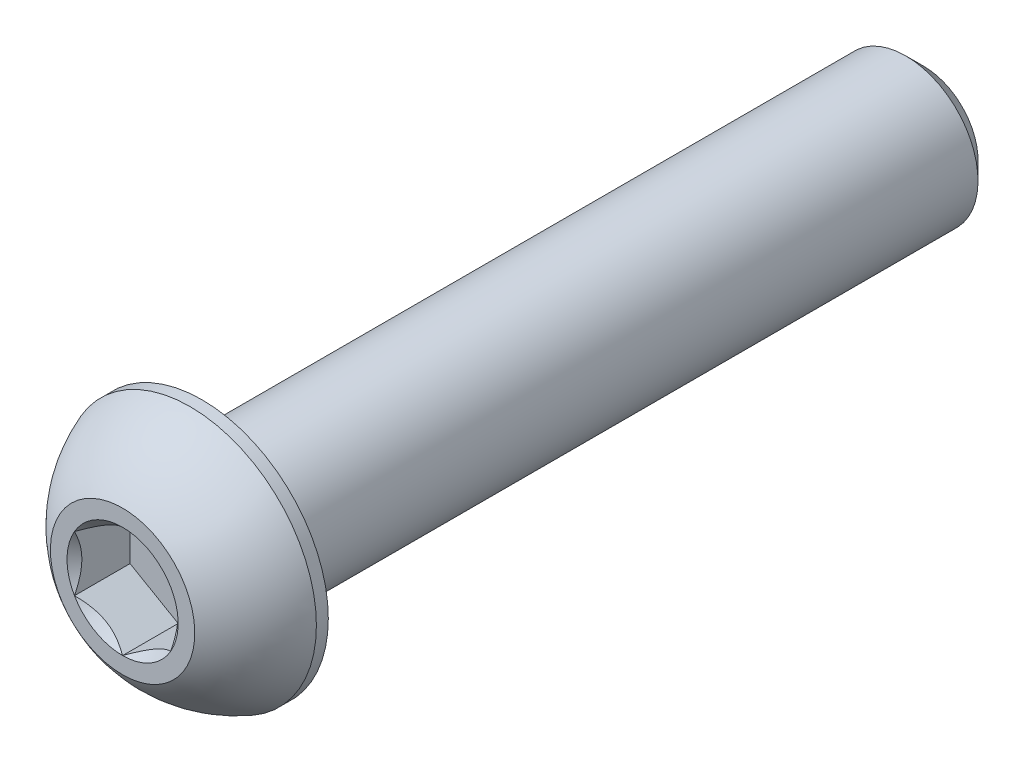
ISO-10303-21;
HEADER;
FILE_DESCRIPTION(('STEP AP214'),'2;1');
FILE_NAME('part.step','',(''),(''),'','','');
FILE_SCHEMA(('AUTOMOTIVE_DESIGN { 1 0 10303 214 1 1 1 1 }'));
ENDSEC;
DATA;
#1=APPLICATION_CONTEXT('core data for automotive mechanical design processes');
#2=APPLICATION_PROTOCOL_DEFINITION('international standard','automotive_design',2000,#1);
#3=PRODUCT_CONTEXT('',#1,'mechanical');
#4=PRODUCT('Part','Part','',(#3));
#5=PRODUCT_RELATED_PRODUCT_CATEGORY('part','',(#4));
#6=PRODUCT_DEFINITION_FORMATION('','',#4);
#7=PRODUCT_DEFINITION_CONTEXT('part definition',#1,'design');
#8=PRODUCT_DEFINITION('design','',#6,#7);
#9=PRODUCT_DEFINITION_SHAPE('','',#8);
#10=(LENGTH_UNIT() NAMED_UNIT(*) SI_UNIT(.MILLI.,.METRE.));
#11=(NAMED_UNIT(*) PLANE_ANGLE_UNIT() SI_UNIT($,.RADIAN.));
#12=(NAMED_UNIT(*) SI_UNIT($,.STERADIAN.) SOLID_ANGLE_UNIT());
#13=UNCERTAINTY_MEASURE_WITH_UNIT(LENGTH_MEASURE(1.E-05),#10,'distance_accuracy_value','');
#14=(GEOMETRIC_REPRESENTATION_CONTEXT(3) GLOBAL_UNCERTAINTY_ASSIGNED_CONTEXT((#13)) GLOBAL_UNIT_ASSIGNED_CONTEXT((#10,
#11,#12)) REPRESENTATION_CONTEXT('',''));
#15=CARTESIAN_POINT('',(0.,0.,0.));
#16=DIRECTION('',(0.,0.,1.));
#17=DIRECTION('',(1.,0.,0.));
#18=AXIS2_PLACEMENT_3D('',#15,#16,#17);
#19=CARTESIAN_POINT('',(0.,-3.00000000000002,-33.3));
#20=DIRECTION('',(0.,0.,-1.));
#21=DIRECTION('',(0.,1.,0.));
#22=AXIS2_PLACEMENT_3D('',#19,#20,#21);
#23=PLANE('',#22);
#24=CARTESIAN_POINT('',(0.,0.,-33.3));
#25=DIRECTION('',(0.,0.,-1.));
#26=DIRECTION('',(0.,1.,0.));
#27=AXIS2_PLACEMENT_3D('',#24,#25,#26);
#28=CIRCLE('',#27,2.25000000000002);
#29=CARTESIAN_POINT('',(0.,2.25000000000001,-33.3));
#30=VERTEX_POINT('',#29);
#31=EDGE_CURVE('E178',#30,#30,#28,.T.);
#32=ORIENTED_EDGE('',*,*,#31,.T.);
#33=EDGE_LOOP('',(#32));
#34=FACE_BOUND('',#33,.T.);
#35=ADVANCED_FACE('F38',(#34),#23,.T.);
#36=CARTESIAN_POINT('',(0.,0.,-33.3));
#37=DIRECTION('',(0.,0.,-1.));
#38=DIRECTION('',(0.,1.,0.));
#39=AXIS2_PLACEMENT_3D('',#36,#37,#38);
#40=CYLINDRICAL_SURFACE('',#39,3.00000000000001);
#41=CARTESIAN_POINT('',(0.,0.,-32.55));
#42=DIRECTION('',(0.,0.,-1.));
#43=DIRECTION('',(0.,1.,0.));
#44=AXIS2_PLACEMENT_3D('',#41,#42,#43);
#45=CIRCLE('',#44,3.00000000000001);
#46=CARTESIAN_POINT('',(0.,3.,-32.55));
#47=VERTEX_POINT('',#46);
#48=EDGE_CURVE('E52',#47,#47,#45,.F.);
#49=ORIENTED_EDGE('',*,*,#48,.T.);
#50=EDGE_LOOP('',(#49));
#51=FACE_BOUND('',#50,.T.);
#52=CARTESIAN_POINT('',(0.,0.,-3.3));
#53=DIRECTION('',(0.,0.,1.));
#54=DIRECTION('',(1.,0.,0.));
#55=AXIS2_PLACEMENT_3D('',#52,#53,#54);
#56=CIRCLE('',#55,3.00000000000001);
#57=CARTESIAN_POINT('',(3.00000000000001,0.,-3.3));
#58=VERTEX_POINT('',#57);
#59=EDGE_CURVE('E175',#58,#58,#56,.F.);
#60=ORIENTED_EDGE('',*,*,#59,.T.);
#61=EDGE_LOOP('',(#60));
#62=FACE_BOUND('',#61,.T.);
#63=ADVANCED_FACE('F183',(#51,#62),#40,.T.);
#64=CARTESIAN_POINT('',(0.,0.,-33.3));
#65=DIRECTION('',(0.,0.,1.));
#66=DIRECTION('',(0.,-1.,0.));
#67=AXIS2_PLACEMENT_3D('',#64,#65,#66);
#68=CONICAL_SURFACE('',#67,2.25000000000002,0.785398163397448);
#69=ORIENTED_EDGE('',*,*,#48,.F.);
#70=EDGE_LOOP('',(#69));
#71=FACE_BOUND('',#70,.T.);
#72=ORIENTED_EDGE('',*,*,#31,.F.);
#73=EDGE_LOOP('',(#72));
#74=FACE_BOUND('',#73,.T.);
#75=ADVANCED_FACE('F40',(#71,#74),#68,.T.);
#76=CARTESIAN_POINT('',(0.,0.,-4.71132352941177));
#77=DIRECTION('',(0.,0.,1.));
#78=DIRECTION('',(0.,-1.,0.));
#79=AXIS2_PLACEMENT_3D('',#76,#77,#78);
#80=SPHERICAL_SURFACE('',#79,5.58538892099638);
#81=CARTESIAN_POINT('',(0.,0.,0.));
#82=DIRECTION('',(0.,0.,1.));
#83=DIRECTION('',(1.,0.,0.));
#84=AXIS2_PLACEMENT_3D('',#81,#82,#83);
#85=CIRCLE('',#84,3.);
#86=CARTESIAN_POINT('',(0.,-3.,0.));
#87=VERTEX_POINT('',#86);
#88=EDGE_CURVE('E172',#87,#87,#85,.T.);
#89=CARTESIAN_POINT('',(0.,0.,-2.805));
#90=DIRECTION('',(0.,0.,1.));
#91=DIRECTION('',(1.,0.,0.));
#92=AXIS2_PLACEMENT_3D('',#89,#90,#91);
#93=CIRCLE('',#92,5.25);
#94=CARTESIAN_POINT('',(0.,-5.25,-2.805));
#95=VERTEX_POINT('',#94);
#96=EDGE_CURVE('E166',#95,#95,#93,.T.);
#97=CARTESIAN_POINT('',(0.,-3.,0.));
#98=CARTESIAN_POINT('',(0.,-3.03216841047471,-0.0204836076687055));
#99=CARTESIAN_POINT('',(0.,-3.06412696701745,-0.041296774706013));
#100=CARTESIAN_POINT('',(0.,-3.12761110680184,-0.0835732798883741));
#101=CARTESIAN_POINT('',(0.,-3.15913669004349,-0.105036618033428));
#102=CARTESIAN_POINT('',(0.,-3.22174161778855,-0.148604517801822));
#103=CARTESIAN_POINT('',(0.,-3.25282096229196,-0.170709079425164));
#104=CARTESIAN_POINT('',(0.,-3.3145203830256,-0.215550136391721));
#105=CARTESIAN_POINT('',(0.,-3.34514045925583,-0.238286631734938));
#106=CARTESIAN_POINT('',(0.,-3.40590849355866,-0.284382020830627));
#107=CARTESIAN_POINT('',(0.,-3.43605645163126,-0.3077409145831));
#108=CARTESIAN_POINT('',(0.,-3.49586760131366,-0.355071298801883));
#109=CARTESIAN_POINT('',(0.,-3.52553079292345,-0.379042789268192));
#110=CARTESIAN_POINT('',(0.,-3.5843599638299,-0.427588309600936));
#111=CARTESIAN_POINT('',(0.,-3.61352594312657,-0.45216233946737));
#112=CARTESIAN_POINT('',(0.,-3.67134845242053,-0.501902628105112));
#113=CARTESIAN_POINT('',(0.,-3.70000498241782,-0.527068886876421));
#114=CARTESIAN_POINT('',(0.,-3.75679656980689,-0.577983074450791));
#115=CARTESIAN_POINT('',(0.,-3.78493162719868,-0.603731003253853));
#116=CARTESIAN_POINT('',(0.,-3.84066846488056,-0.655797727942868));
#117=CARTESIAN_POINT('',(0.,-3.86827024517066,-0.682116523828821));
#118=CARTESIAN_POINT('',(0.,-3.92292894789283,-0.735313940225863));
#119=CARTESIAN_POINT('',(0.,-3.94998587032491,-0.762192560736951));
#120=CARTESIAN_POINT('',(0.,-4.00354350517958,-0.81649834904145));
#121=CARTESIAN_POINT('',(0.,-4.03004421760217,-0.843925516834861));
#122=CARTESIAN_POINT('',(0.,-4.08247831365261,-0.899316892210192));
#123=CARTESIAN_POINT('',(0.,-4.10841169728045,-0.927281099792112));
#124=CARTESIAN_POINT('',(0.,-4.1597002549878,-0.983734821927125));
#125=CARTESIAN_POINT('',(0.,-4.18505542906731,-1.01222433648022));
#126=CARTESIAN_POINT('',(0.,-4.23517692952119,-1.06971671933959));
#127=CARTESIAN_POINT('',(0.,-4.25994325589556,-1.09871958764587));
#128=CARTESIAN_POINT('',(0.,-4.30887666984256,-1.15722650940808));
#129=CARTESIAN_POINT('',(0.,-4.33304375741518,-1.18673056286401));
#130=CARTESIAN_POINT('',(0.,-4.38076855408201,-1.24622747604199));
#131=CARTESIAN_POINT('',(0.,-4.40432626317621,-1.27622033576403));
#132=CARTESIAN_POINT('',(0.,-4.45082241888372,-1.33668227750444));
#133=CARTESIAN_POINT('',(0.,-4.47376086549703,-1.3671513595228));
#134=CARTESIAN_POINT('',(0.,-4.51900887206146,-1.4285529620796));
#135=CARTESIAN_POINT('',(0.,-4.54131843201258,-1.45948548261803));
#136=CARTESIAN_POINT('',(0.,-4.58529930493053,-1.52180098399588));
#137=CARTESIAN_POINT('',(0.,-4.60697061789735,-1.5531839648353));
#138=CARTESIAN_POINT('',(0.,-4.64966590431095,-1.61638721959847));
#139=CARTESIAN_POINT('',(0.,-4.67068987775773,-1.64820749352221));
#140=CARTESIAN_POINT('',(0.,-4.71208166419702,-1.71227198376418));
#141=CARTESIAN_POINT('',(0.,-4.73244947718953,-1.74451620008241));
#142=CARTESIAN_POINT('',(0.,-4.77252039708775,-1.80941504655213));
#143=CARTESIAN_POINT('',(0.,-4.79222350399347,-1.84206967670363));
#144=CARTESIAN_POINT('',(0.,-4.83095674497554,-1.90777565008234));
#145=CARTESIAN_POINT('',(0.,-4.84998687905189,-1.94082699330955));
#146=CARTESIAN_POINT('',(0.,-4.8873661899807,-2.00731252563814));
#147=CARTESIAN_POINT('',(0.,-4.90571536683316,-2.04074671473952));
#148=CARTESIAN_POINT('',(0.,-4.94172506465618,-2.10798391097428));
#149=CARTESIAN_POINT('',(0.,-4.95938558562673,-2.14178691810765));
#150=CARTESIAN_POINT('',(0.,-4.99401056185103,-2.20974756786458));
#151=CARTESIAN_POINT('',(0.,-5.01097501710478,-2.24390521048815));
#152=CARTESIAN_POINT('',(0.,-5.04420074452798,-2.31256079972767));
#153=CARTESIAN_POINT('',(0.,-5.06046201669743,-2.34705874634363));
#154=CARTESIAN_POINT('',(0.,-5.09227455404011,-2.41638046989934));
#155=CARTESIAN_POINT('',(0.,-5.10782581921333,-2.45120424683909));
#156=CARTESIAN_POINT('',(0.,-5.13821182242717,-2.52116301839372));
#157=CARTESIAN_POINT('',(0.,-5.15304656046779,-2.5562980130086));
#158=CARTESIAN_POINT('',(0.,-5.18199326796146,-2.62686448517116));
#159=CARTESIAN_POINT('',(0.,-5.19610523741451,-2.66229596271883));
#160=CARTESIAN_POINT('',(0.,-5.22360055144049,-2.7334405099534));
#161=CARTESIAN_POINT('',(0.,-5.23698389601341,-2.76915357964029));
#162=CARTESIAN_POINT('',(0.,-5.25,-2.805));
#163=B_SPLINE_CURVE_WITH_KNOTS('',3,(#97,#98,#99,#100,#101,#102,#103,#104,#105,#106,#107,#108,
#109,#110,#111,#112,#113,#114,#115,#116,#117,#118,#119,#120,#121,#122,#123,#124,#125,#126,#127,
#128,#129,#130,#131,#132,#133,#134,#135,#136,#137,#138,#139,#140,#141,#142,#143,#144,#145,#146,
#147,#148,#149,#150,#151,#152,#153,#154,#155,#156,#157,#158,#159,#160,#161,#162),.UNSPECIFIED.,
.F.,.F.,(4,2,2,2,2,2,2,2,2,2,2,2,2,2,2,2,2,2,2,2,2,2,2,2,2,2,2,2,2,2,2,2,4),(0.,
0.114407188898184,0.228814377796368,0.343221566694552,0.457628755592736,0.572035944490919,
0.686443133389104,0.800850322287288,0.915257511185472,1.02966470008366,1.14407188898184,
1.25847907788002,1.37288626677821,1.48729345567639,1.60170064457458,1.71610783347276,
1.83051502237094,1.94492221126913,2.05932940016731,2.1737365890655,2.28814377796368,
2.40255096686186,2.51695815576005,2.63136534465823,2.74577253355642,2.8601797224546,
2.97458691135278,3.08899410025097,3.20340128914915,3.31780847804734,3.43221566694552,
3.5466228558437,3.66103004474189),.UNSPECIFIED.);
#164=EDGE_CURVE('BSEAM188',#87,#95,#163,.T.);
#165=ORIENTED_EDGE('',*,*,#88,.F.);
#166=ORIENTED_EDGE('',*,*,#96,.T.);
#167=ORIENTED_EDGE('',*,*,#164,.T.);
#168=ORIENTED_EDGE('',*,*,#164,.F.);
#169=EDGE_LOOP('',(#165,#167,#166,#168));
#170=FACE_BOUND('',#169,.T.);
#171=ADVANCED_FACE('F188',(#170),#80,.T.);
#172=CARTESIAN_POINT('',(0.,-3.,0.));
#173=DIRECTION('',(0.,0.,-1.));
#174=DIRECTION('',(-1.,0.,0.));
#175=AXIS2_PLACEMENT_3D('',#172,#173,#174);
#176=PLANE('',#175);
#177=CARTESIAN_POINT('',(0.,0.,0.));
#178=DIRECTION('',(0.,0.,1.));
#179=DIRECTION('',(1.,0.,0.));
#180=AXIS2_PLACEMENT_3D('',#177,#178,#179);
#181=CIRCLE('',#180,2.3094010767585);
#182=CARTESIAN_POINT('',(-2.,1.15470053837925,0.));
#183=VERTEX_POINT('',#182);
#184=CARTESIAN_POINT('',(-2.,-1.15470053837925,0.));
#185=VERTEX_POINT('',#184);
#186=EDGE_CURVE('E65',#183,#185,#181,.T.);
#187=ORIENTED_EDGE('',*,*,#186,.F.);
#188=CARTESIAN_POINT('',(0.,2.3094010767585,0.));
#189=VERTEX_POINT('',#188);
#190=EDGE_CURVE('E137',#189,#183,#181,.T.);
#191=ORIENTED_EDGE('',*,*,#190,.F.);
#192=CARTESIAN_POINT('',(2.,1.15470053837925,0.));
#193=VERTEX_POINT('',#192);
#194=EDGE_CURVE('E134',#193,#189,#181,.T.);
#195=ORIENTED_EDGE('',*,*,#194,.F.);
#196=CARTESIAN_POINT('',(2.,-1.15470053837925,0.));
#197=VERTEX_POINT('',#196);
#198=EDGE_CURVE('E105',#197,#193,#181,.T.);
#199=ORIENTED_EDGE('',*,*,#198,.F.);
#200=CARTESIAN_POINT('',(0.,-2.3094010767585,0.));
#201=VERTEX_POINT('',#200);
#202=EDGE_CURVE('E97',#201,#197,#181,.T.);
#203=ORIENTED_EDGE('',*,*,#202,.F.);
#204=EDGE_CURVE('E58',#185,#201,#181,.T.);
#205=ORIENTED_EDGE('',*,*,#204,.F.);
#206=EDGE_LOOP('',(#187,#191,#195,#199,#203,#205));
#207=FACE_BOUND('',#206,.T.);
#208=ORIENTED_EDGE('',*,*,#88,.T.);
#209=EDGE_LOOP('',(#208));
#210=FACE_BOUND('',#209,.T.);
#211=ADVANCED_FACE('F131',(#207,#210),#176,.F.);
#212=CARTESIAN_POINT('',(0.,-5.25,-3.3));
#213=DIRECTION('',(0.,0.,1.));
#214=DIRECTION('',(1.,0.,0.));
#215=AXIS2_PLACEMENT_3D('',#212,#213,#214);
#216=PLANE('',#215);
#217=ORIENTED_EDGE('',*,*,#59,.F.);
#218=EDGE_LOOP('',(#217));
#219=FACE_BOUND('',#218,.T.);
#220=CARTESIAN_POINT('',(0.,0.,-3.3));
#221=DIRECTION('',(0.,0.,1.));
#222=DIRECTION('',(1.,0.,0.));
#223=AXIS2_PLACEMENT_3D('',#220,#221,#222);
#224=CIRCLE('',#223,5.25);
#225=CARTESIAN_POINT('',(5.25,0.,-3.3));
#226=VERTEX_POINT('',#225);
#227=EDGE_CURVE('E169',#226,#226,#224,.T.);
#228=ORIENTED_EDGE('',*,*,#227,.F.);
#229=EDGE_LOOP('',(#228));
#230=FACE_BOUND('',#229,.T.);
#231=ADVANCED_FACE('F202',(#219,#230),#216,.F.);
#232=CARTESIAN_POINT('',(0.,0.,0.));
#233=DIRECTION('',(0.,0.,1.));
#234=DIRECTION('',(1.,0.,0.));
#235=AXIS2_PLACEMENT_3D('',#232,#233,#234);
#236=CYLINDRICAL_SURFACE('',#235,5.25);
#237=ORIENTED_EDGE('',*,*,#96,.F.);
#238=EDGE_LOOP('',(#237));
#239=FACE_BOUND('',#238,.T.);
#240=ORIENTED_EDGE('',*,*,#227,.T.);
#241=EDGE_LOOP('',(#240));
#242=FACE_BOUND('',#241,.T.);
#243=ADVANCED_FACE('F205',(#239,#242),#236,.T.);
#244=CARTESIAN_POINT('',(0.,0.,0.));
#245=DIRECTION('',(0.,0.,1.));
#246=DIRECTION('',(1.,0.,0.));
#247=AXIS2_PLACEMENT_3D('',#244,#245,#246);
#248=CONICAL_SURFACE('',#247,2.3094010767585,0.78539816339745);
#249=ORIENTED_EDGE('',*,*,#198,.T.);
#250=CARTESIAN_POINT('',(2.,-2.30294417292923,0.740771355027719));
#251=CARTESIAN_POINT('',(2.,-2.24687002663712,0.698443273625962));
#252=CARTESIAN_POINT('',(2.,-2.19048190536959,0.656525156864336));
#253=CARTESIAN_POINT('',(2.,-2.07695390496424,0.573690417861016));
#254=CARTESIAN_POINT('',(2.,-2.01981384066453,0.532774049668073));
#255=CARTESIAN_POINT('',(2.,-1.90424016804775,0.451833452018562));
#256=CARTESIAN_POINT('',(2.,-1.84579996743909,0.411818591559867));
#257=CARTESIAN_POINT('',(2.,-1.7279274546176,0.333288993664292));
#258=CARTESIAN_POINT('',(2.,-1.66849521292323,0.294774150243141));
#259=CARTESIAN_POINT('',(2.,-1.48162995710019,0.177640651604293));
#260=CARTESIAN_POINT('',(2.,-1.35220318163536,0.102145901729643));
#261=CARTESIAN_POINT('',(2.,-1.08689521592924,-0.0359506490056192));
#262=CARTESIAN_POINT('',(2.,-0.951037763938189,-0.0985959140965047));
#263=CARTESIAN_POINT('',(2.,-0.747111912259406,-0.175236456124857));
#264=CARTESIAN_POINT('',(2.,-0.682064034147873,-0.197232820080877));
#265=CARTESIAN_POINT('',(2.,-0.550398103294749,-0.23600331233986));
#266=CARTESIAN_POINT('',(2.,-0.483779942722473,-0.252777080878817));
#267=CARTESIAN_POINT('',(2.,-0.350484328847652,-0.279951742115555));
#268=CARTESIAN_POINT('',(2.,-0.283829489364783,-0.290461823258314));
#269=CARTESIAN_POINT('',(2.,-0.149806987139375,-0.304903914455084));
#270=CARTESIAN_POINT('',(2.,-0.0824394489341198,-0.308837055266886));
#271=CARTESIAN_POINT('',(2.,0.0499055622944916,-0.309833523066282));
#272=CARTESIAN_POINT('',(2.,0.114881285143174,-0.30714035514959));
#273=CARTESIAN_POINT('',(2.,0.244275921482762,-0.295569929577307));
#274=CARTESIAN_POINT('',(2.,0.308694780266755,-0.286692071166775));
#275=CARTESIAN_POINT('',(2.,0.437599788610706,-0.263086340703851));
#276=CARTESIAN_POINT('',(2.,0.502067428644597,-0.248258916553487));
#277=CARTESIAN_POINT('',(2.,0.629594322598307,-0.213542116372029));
#278=CARTESIAN_POINT('',(2.,0.692653693883152,-0.193653163893723));
#279=CARTESIAN_POINT('',(2.,0.891187889210546,-0.1235530207438));
#280=CARTESIAN_POINT('',(2.,1.02383545707306,-0.0653581996784902));
#281=CARTESIAN_POINT('',(2.,1.28290932150074,0.0640305754595772));
#282=CARTESIAN_POINT('',(2.,1.4093111258757,0.135271231414842));
#283=CARTESIAN_POINT('',(2.,1.59200441438963,0.246441991874721));
#284=CARTESIAN_POINT('',(2.,1.65027549026191,0.283182190337376));
#285=CARTESIAN_POINT('',(2.,1.76581760389243,0.358214514183767));
#286=CARTESIAN_POINT('',(2.,1.82308856543105,0.39650675711804));
#287=CARTESIAN_POINT('',(2.,1.93629654762084,0.474042264081226));
#288=CARTESIAN_POINT('',(2.,1.99224062500539,0.513275276133586));
#289=CARTESIAN_POINT('',(2.,2.103364240299,0.592778830736517));
#290=CARTESIAN_POINT('',(2.,2.15854398422468,0.633049085000598));
#291=CARTESIAN_POINT('',(2.,2.21340370692659,0.673744238145943));
#292=B_SPLINE_CURVE_WITH_KNOTS('',3,(#250,#251,#252,#253,#254,#255,#256,#257,#258,#259,#260,
#261,#262,#263,#264,#265,#266,#267,#268,#269,#270,#271,#272,#273,#274,#275,#276,#277,#278,#279,
#280,#281,#282,#283,#284,#285,#286,#287,#288,#289,#290,#291),.UNSPECIFIED.,.F.,.F.,(4,2,2,2,2,2,
2,2,2,2,2,2,2,2,2,2,2,2,2,2,4),(0.,0.210772731976891,0.421598374658588,0.634057554623487,
0.846501695870169,1.29562155455624,1.74319622821645,1.94902062110207,2.15485918928325,
2.35699582502635,2.5590977043214,2.75388435553556,2.94868993014814,3.14690093452585,
3.34509535789701,3.77838155837653,4.21325029921625,4.41989056685646,4.6265465146092,
4.83152377111289,5.03644465914084),.UNSPECIFIED.);
#293=EDGE_CURVE('E11',#197,#193,#292,.T.);
#294=ORIENTED_EDGE('',*,*,#293,.F.);
#295=EDGE_LOOP('',(#249,#294));
#296=FACE_BOUND('',#295,.T.);
#297=ADVANCED_FACE('F109',(#296),#248,.F.);
#298=ORIENTED_EDGE('',*,*,#194,.T.);
#299=CARTESIAN_POINT('',(2.0002,1.15458506832541,0.000115478713660073));
#300=CARTESIAN_POINT('',(1.93144696596929,1.19427965103065,-0.0395469097744074));
#301=CARTESIAN_POINT('',(1.86154425786449,1.23463799837204,-0.0768800177158378));
#302=CARTESIAN_POINT('',(1.71900475544956,1.31693321846145,-0.145236314863857));
#303=CARTESIAN_POINT('',(1.64635440243464,1.35887791933134,-0.176221466262779));
#304=CARTESIAN_POINT('',(1.49985839894603,1.44345742638069,-0.229299783455857));
#305=CARTESIAN_POINT('',(1.42605006475371,1.48607068799507,-0.251526372823389));
#306=CARTESIAN_POINT('',(1.27680836816474,1.57223542169503,-0.285771183324919));
#307=CARTESIAN_POINT('',(1.20137956608185,1.61578426088223,-0.297814970855865));
#308=CARTESIAN_POINT('',(1.07138449932892,1.69083694766536,-0.308681488094428));
#309=CARTESIAN_POINT('',(1.01698621602989,1.72224381117151,-0.310290246390029));
#310=CARTESIAN_POINT('',(0.908278544480305,1.78500621460364,-0.307581122401288));
#311=CARTESIAN_POINT('',(0.85396919407866,1.81636173267754,-0.303261162242025));
#312=CARTESIAN_POINT('',(0.745863272410661,1.87877671565355,-0.288940432590093));
#313=CARTESIAN_POINT('',(0.692067343445206,1.90983580972306,-0.278933307237993));
#314=CARTESIAN_POINT('',(0.585405737694425,1.97141691651548,-0.25378756975034));
#315=CARTESIAN_POINT('',(0.532539989929286,2.00193897021859,-0.23864935095776));
#316=CARTESIAN_POINT('',(0.397120266910155,2.08012358375727,-0.193705496570809));
#317=CARTESIAN_POINT('',(0.315406165150521,2.12730124240478,-0.160511160574183));
#318=CARTESIAN_POINT('',(0.195252962742198,2.19667172615922,-0.10447417682863));
#319=CARTESIAN_POINT('',(0.155657147890823,2.21953238052245,-0.08478529705306));
#320=CARTESIAN_POINT('',(0.0771990411121287,2.26483018959123,-0.0436126816351289));
#321=CARTESIAN_POINT('',(0.0383363164062608,2.28726759416161,-0.0221300483487535));
#322=CARTESIAN_POINT('',(-0.000199999999998559,2.30951654681234,0.000115478713658964));
#323=B_SPLINE_CURVE_WITH_KNOTS('',3,(#299,#300,#301,#302,#303,#304,#305,#306,#307,#308,#309,
#310,#311,#312,#313,#314,#315,#316,#317,#318,#319,#320,#321,#322),.UNSPECIFIED.,.F.,.F.,(4,2,2,
2,2,2,2,2,2,2,2,4),(0.,0.266420613771064,0.534393751523389,0.798110374376915,1.06116288956937,
1.24939906803722,1.43770123566248,1.62621426093932,1.81471283831913,2.11415604834145,
2.2634717071779,2.41269626969771),.UNSPECIFIED.);
#324=EDGE_CURVE('E136',#193,#189,#323,.T.);
#325=ORIENTED_EDGE('',*,*,#324,.F.);
#326=EDGE_LOOP('',(#298,#325));
#327=FACE_BOUND('',#326,.T.);
#328=ADVANCED_FACE('F290',(#327),#248,.F.);
#329=ORIENTED_EDGE('',*,*,#190,.T.);
#330=CARTESIAN_POINT('',(0.00020000000000133,2.30951654681234,0.000115478713659074));
#331=CARTESIAN_POINT('',(-0.0685530340307042,2.26982196410711,-0.0395469097744084));
#332=CARTESIAN_POINT('',(-0.13845574213551,2.22946361676572,-0.0768800177158387));
#333=CARTESIAN_POINT('',(-0.280995244550435,2.1471683966763,-0.145236314863858));
#334=CARTESIAN_POINT('',(-0.353645597565357,2.10522369580642,-0.17622146626278));
#335=CARTESIAN_POINT('',(-0.500141601053971,2.02064418875706,-0.229299783455859));
#336=CARTESIAN_POINT('',(-0.573949935246294,1.97803092714269,-0.251526372823391));
#337=CARTESIAN_POINT('',(-0.723191631835264,1.89186619344273,-0.285771183324921));
#338=CARTESIAN_POINT('',(-0.798620433918152,1.84831735425552,-0.297814970855867));
#339=CARTESIAN_POINT('',(-0.928615500671079,1.77326466747239,-0.30868148809443));
#340=CARTESIAN_POINT('',(-0.983013783970109,1.74185780396625,-0.310290246390031));
#341=CARTESIAN_POINT('',(-1.09172145551969,1.67909540053412,-0.30758112240129));
#342=CARTESIAN_POINT('',(-1.14603080592134,1.64773988246021,-0.303261162242027));
#343=CARTESIAN_POINT('',(-1.25413672758934,1.5853248994842,-0.288940432590095));
#344=CARTESIAN_POINT('',(-1.30793265655479,1.55426580541469,-0.278933307237995));
#345=CARTESIAN_POINT('',(-1.41459426230557,1.49268469862228,-0.253787569750342));
#346=CARTESIAN_POINT('',(-1.46746001007071,1.46216264491916,-0.238649350957762));
#347=CARTESIAN_POINT('',(-1.60287973308984,1.38397803138048,-0.193705496570812));
#348=CARTESIAN_POINT('',(-1.68459383484948,1.33680037273297,-0.160511160574186));
#349=CARTESIAN_POINT('',(-1.8047470372578,1.26742988897853,-0.104474176828632));
#350=CARTESIAN_POINT('',(-1.84434285210918,1.24456923461531,-0.0847852970530618));
#351=CARTESIAN_POINT('',(-1.92280095888787,1.19927142554652,-0.0436126816351307));
#352=CARTESIAN_POINT('',(-1.96166368359374,1.17683402097614,-0.0221300483487552));
#353=CARTESIAN_POINT('',(-2.0002,1.15458506832541,0.000115478713657302));
#354=B_SPLINE_CURVE_WITH_KNOTS('',3,(#330,#331,#332,#333,#334,#335,#336,#337,#338,#339,#340,
#341,#342,#343,#344,#345,#346,#347,#348,#349,#350,#351,#352,#353),.UNSPECIFIED.,.F.,.F.,(4,2,2,
2,2,2,2,2,2,2,2,4),(0.,0.266420613771064,0.534393751523389,0.798110374376916,1.06116288956937,
1.24939906803722,1.43770123566248,1.62621426093932,1.81471283831913,2.11415604834145,
2.26347170717791,2.41269626969771),.UNSPECIFIED.);
#355=EDGE_CURVE('E141',#189,#183,#354,.T.);
#356=ORIENTED_EDGE('',*,*,#355,.F.);
#357=EDGE_LOOP('',(#329,#356));
#358=FACE_BOUND('',#357,.T.);
#359=ADVANCED_FACE('F144',(#358),#248,.F.);
#360=ORIENTED_EDGE('',*,*,#186,.T.);
#361=CARTESIAN_POINT('',(-2.,-2.30294417292923,0.740771355027721));
#362=CARTESIAN_POINT('',(-2.,-2.24687002663712,0.698443273625963));
#363=CARTESIAN_POINT('',(-2.,-2.19048190536959,0.656525156864337));
#364=CARTESIAN_POINT('',(-2.,-2.07695390496424,0.573690417861017));
#365=CARTESIAN_POINT('',(-2.,-2.01981384066454,0.532774049668073));
#366=CARTESIAN_POINT('',(-2.,-1.90424016804776,0.451833452018563));
#367=CARTESIAN_POINT('',(-2.,-1.8457999674391,0.411818591559867));
#368=CARTESIAN_POINT('',(-2.,-1.7279274546176,0.333288993664293));
#369=CARTESIAN_POINT('',(-2.,-1.66849521292324,0.294774150243142));
#370=CARTESIAN_POINT('',(-2.,-1.4816299571002,0.177640651604294));
#371=CARTESIAN_POINT('',(-2.,-1.35220318163536,0.102145901729644));
#372=CARTESIAN_POINT('',(-2.,-1.08689521592924,-0.0359506490056196));
#373=CARTESIAN_POINT('',(-2.,-0.951037763938191,-0.0985959140965053));
#374=CARTESIAN_POINT('',(-2.,-0.747111912259408,-0.175236456124857));
#375=CARTESIAN_POINT('',(-2.,-0.682064034147875,-0.197232820080877));
#376=CARTESIAN_POINT('',(-2.,-0.550398103294751,-0.236003312339861));
#377=CARTESIAN_POINT('',(-2.,-0.483779942722475,-0.252777080878818));
#378=CARTESIAN_POINT('',(-2.,-0.350484328847654,-0.279951742115556));
#379=CARTESIAN_POINT('',(-2.,-0.283829489364785,-0.290461823258315));
#380=CARTESIAN_POINT('',(-2.,-0.149806987139377,-0.304903914455085));
#381=CARTESIAN_POINT('',(-2.,-0.0824394489341219,-0.308837055266887));
#382=CARTESIAN_POINT('',(-2.,0.0499055622944896,-0.309833523066284));
#383=CARTESIAN_POINT('',(-2.,0.114881285143172,-0.307140355149592));
#384=CARTESIAN_POINT('',(-2.,0.24427592148276,-0.295569929577308));
#385=CARTESIAN_POINT('',(-2.,0.308694780266753,-0.286692071166777));
#386=CARTESIAN_POINT('',(-2.,0.437599788610705,-0.263086340703852));
#387=CARTESIAN_POINT('',(-2.,0.502067428644595,-0.248258916553489));
#388=CARTESIAN_POINT('',(-2.,0.629594322598306,-0.213542116372031));
#389=CARTESIAN_POINT('',(-2.,0.69265369388315,-0.193653163893725));
#390=CARTESIAN_POINT('',(-2.,0.891187889210544,-0.123553020743803));
#391=CARTESIAN_POINT('',(-2.,1.02383545707306,-0.0653581996784927));
#392=CARTESIAN_POINT('',(-2.,1.28290932150074,0.0640305754595745));
#393=CARTESIAN_POINT('',(-2.,1.4093111258757,0.135271231414839));
#394=CARTESIAN_POINT('',(-2.,1.59200441438963,0.246441991874718));
#395=CARTESIAN_POINT('',(-2.,1.65027549026191,0.283182190337372));
#396=CARTESIAN_POINT('',(-2.,1.76581760389242,0.358214514183763));
#397=CARTESIAN_POINT('',(-2.,1.82308856543104,0.396506757118036));
#398=CARTESIAN_POINT('',(-2.,1.93629654762084,0.474042264081222));
#399=CARTESIAN_POINT('',(-2.,1.99224062500538,0.513275276133582));
#400=CARTESIAN_POINT('',(-2.,2.10336424029899,0.592778830736512));
#401=CARTESIAN_POINT('',(-2.,2.15854398422468,0.633049085000594));
#402=CARTESIAN_POINT('',(-2.,2.21340370692658,0.673744238145939));
#403=B_SPLINE_CURVE_WITH_KNOTS('',3,(#361,#362,#363,#364,#365,#366,#367,#368,#369,#370,#371,
#372,#373,#374,#375,#376,#377,#378,#379,#380,#381,#382,#383,#384,#385,#386,#387,#388,#389,#390,
#391,#392,#393,#394,#395,#396,#397,#398,#399,#400,#401,#402),.UNSPECIFIED.,.F.,.F.,(4,2,2,2,2,2,
2,2,2,2,2,2,2,2,2,2,2,2,2,2,4),(0.,0.210772731976891,0.421598374658589,0.634057554623488,
0.84650169587017,1.29562155455624,1.74319622821645,1.94902062110207,2.15485918928326,
2.35699582502635,2.5590977043214,2.75388435553556,2.94868993014815,3.14690093452585,
3.34509535789702,3.77838155837653,4.21325029921625,4.41989056685646,4.6265465146092,
4.83152377111289,5.03644465914084),.UNSPECIFIED.);
#404=EDGE_CURVE('E148',#183,#185,#403,.F.);
#405=ORIENTED_EDGE('',*,*,#404,.F.);
#406=EDGE_LOOP('',(#360,#405));
#407=FACE_BOUND('',#406,.T.);
#408=ADVANCED_FACE('F284',(#407),#248,.F.);
#409=ORIENTED_EDGE('',*,*,#204,.T.);
#410=CARTESIAN_POINT('',(-2.0002,-1.15458506832541,0.000115478713657905));
#411=CARTESIAN_POINT('',(-1.93144696596929,-1.19427965103064,-0.0395469097744099));
#412=CARTESIAN_POINT('',(-1.86154425786449,-1.23463799837204,-0.0768800177158401));
#413=CARTESIAN_POINT('',(-1.71900475544956,-1.31693321846145,-0.145236314863859));
#414=CARTESIAN_POINT('',(-1.64635440243464,-1.35887791933134,-0.176221466262781));
#415=CARTESIAN_POINT('',(-1.49985839894603,-1.44345742638069,-0.229299783455859));
#416=CARTESIAN_POINT('',(-1.4260500647537,-1.48607068799507,-0.251526372823391));
#417=CARTESIAN_POINT('',(-1.27680836816473,-1.57223542169502,-0.285771183324921));
#418=CARTESIAN_POINT('',(-1.20137956608185,-1.61578426088223,-0.297814970855867));
#419=CARTESIAN_POINT('',(-1.07138449932892,-1.69083694766536,-0.30868148809443));
#420=CARTESIAN_POINT('',(-1.01698621602989,-1.72224381117151,-0.310290246390031));
#421=CARTESIAN_POINT('',(-0.908278544480305,-1.78500621460364,-0.30758112240129));
#422=CARTESIAN_POINT('',(-0.853969194078659,-1.81636173267754,-0.303261162242027));
#423=CARTESIAN_POINT('',(-0.745863272410661,-1.87877671565355,-0.288940432590096));
#424=CARTESIAN_POINT('',(-0.692067343445206,-1.90983580972306,-0.278933307237995));
#425=CARTESIAN_POINT('',(-0.585405737694425,-1.97141691651547,-0.253787569750342));
#426=CARTESIAN_POINT('',(-0.532539989929286,-2.00193897021859,-0.238649350957762));
#427=CARTESIAN_POINT('',(-0.397120266910155,-2.08012358375727,-0.193705496570811));
#428=CARTESIAN_POINT('',(-0.31540616515052,-2.12730124240478,-0.160511160574186));
#429=CARTESIAN_POINT('',(-0.195252962742197,-2.19667172615922,-0.104474176828632));
#430=CARTESIAN_POINT('',(-0.155657147890822,-2.21953238052245,-0.0847852970530614));
#431=CARTESIAN_POINT('',(-0.077199041112127,-2.26483018959123,-0.04361268163513));
#432=CARTESIAN_POINT('',(-0.0383363164062589,-2.28726759416161,-0.0221300483487544));
#433=CARTESIAN_POINT('',(0.000200000000000635,-2.30951654681234,0.000115478713658089));
#434=B_SPLINE_CURVE_WITH_KNOTS('',3,(#410,#411,#412,#413,#414,#415,#416,#417,#418,#419,#420,
#421,#422,#423,#424,#425,#426,#427,#428,#429,#430,#431,#432,#433),.UNSPECIFIED.,.F.,.F.,(4,2,2,
2,2,2,2,2,2,2,2,4),(0.,0.266420613771064,0.534393751523388,0.798110374376914,1.06116288956936,
1.24939906803722,1.43770123566247,1.62621426093932,1.81471283831913,2.11415604834145,
2.2634717071779,2.41269626969771),.UNSPECIFIED.);
#435=EDGE_CURVE('E121',#185,#201,#434,.T.);
#436=ORIENTED_EDGE('',*,*,#435,.F.);
#437=EDGE_LOOP('',(#409,#436));
#438=FACE_BOUND('',#437,.T.);
#439=ADVANCED_FACE('F232',(#438),#248,.F.);
#440=ORIENTED_EDGE('',*,*,#202,.T.);
#441=CARTESIAN_POINT('',(-0.000199999999999146,-2.30951654681234,0.000115478713658207));
#442=CARTESIAN_POINT('',(0.0685530340307062,-2.26982196410711,-0.0395469097744093));
#443=CARTESIAN_POINT('',(0.138455742135512,-2.22946361676571,-0.0768800177158394));
#444=CARTESIAN_POINT('',(0.280995244550437,-2.1471683966763,-0.145236314863858));
#445=CARTESIAN_POINT('',(0.353645597565359,-2.10522369580642,-0.17622146626278));
#446=CARTESIAN_POINT('',(0.500141601053972,-2.02064418875706,-0.229299783455858));
#447=CARTESIAN_POINT('',(0.573949935246295,-1.97803092714269,-0.25152637282339));
#448=CARTESIAN_POINT('',(0.723191631835264,-1.89186619344273,-0.28577118332492));
#449=CARTESIAN_POINT('',(0.798620433918152,-1.84831735425552,-0.297814970855866));
#450=CARTESIAN_POINT('',(0.928615500671079,-1.77326466747239,-0.308681488094429));
#451=CARTESIAN_POINT('',(0.983013783970109,-1.74185780396625,-0.310290246390031));
#452=CARTESIAN_POINT('',(1.09172145551969,-1.67909540053412,-0.30758112240129));
#453=CARTESIAN_POINT('',(1.14603080592134,-1.64773988246021,-0.303261162242027));
#454=CARTESIAN_POINT('',(1.25413672758934,-1.5853248994842,-0.288940432590095));
#455=CARTESIAN_POINT('',(1.30793265655479,-1.55426580541469,-0.278933307237995));
#456=CARTESIAN_POINT('',(1.41459426230557,-1.49268469862228,-0.253787569750342));
#457=CARTESIAN_POINT('',(1.46746001007071,-1.46216264491916,-0.238649350957761));
#458=CARTESIAN_POINT('',(1.60287973308984,-1.38397803138048,-0.193705496570811));
#459=CARTESIAN_POINT('',(1.68459383484948,-1.33680037273297,-0.160511160574185));
#460=CARTESIAN_POINT('',(1.8047470372578,-1.26742988897853,-0.104474176828631));
#461=CARTESIAN_POINT('',(1.84434285210918,-1.24456923461531,-0.0847852970530604));
#462=CARTESIAN_POINT('',(1.92280095888787,-1.19927142554652,-0.0436126816351289));
#463=CARTESIAN_POINT('',(1.96166368359374,-1.17683402097614,-0.0221300483487534));
#464=CARTESIAN_POINT('',(2.0002,-1.15458506832541,0.000115478713659019));
#465=B_SPLINE_CURVE_WITH_KNOTS('',3,(#441,#442,#443,#444,#445,#446,#447,#448,#449,#450,#451,
#452,#453,#454,#455,#456,#457,#458,#459,#460,#461,#462,#463,#464),.UNSPECIFIED.,.F.,.F.,(4,2,2,
2,2,2,2,2,2,2,2,4),(0.,0.266420613771063,0.534393751523388,0.798110374376913,1.06116288956936,
1.24939906803722,1.43770123566247,1.62621426093931,1.81471283831913,2.11415604834145,
2.2634717071779,2.41269626969771),.UNSPECIFIED.);
#466=EDGE_CURVE('E101',#201,#197,#465,.T.);
#467=ORIENTED_EDGE('',*,*,#466,.F.);
#468=EDGE_LOOP('',(#440,#467));
#469=FACE_BOUND('',#468,.T.);
#470=ADVANCED_FACE('F99',(#469),#248,.F.);
#471=CARTESIAN_POINT('',(2.,-1.15470053837925,-2.31));
#472=DIRECTION('',(0.,0.,1.));
#473=DIRECTION('',(1.,0.,0.));
#474=AXIS2_PLACEMENT_3D('',#471,#472,#473);
#475=PLANE('',#474);
#476=DIRECTION('',(0.866025403784438,0.5,0.));
#477=VECTOR('',#476,1.);
#478=CARTESIAN_POINT('',(0.,-2.3094010767585,-2.31));
#479=LINE('',#478,#477);
#480=CARTESIAN_POINT('',(0.,-2.3094010767585,-2.31));
#481=VERTEX_POINT('',#480);
#482=CARTESIAN_POINT('',(2.,-1.15470053837925,-2.31));
#483=VERTEX_POINT('',#482);
#484=EDGE_CURVE('E120',#481,#483,#479,.T.);
#485=ORIENTED_EDGE('',*,*,#484,.T.);
#486=DIRECTION('',(0.,1.,0.));
#487=VECTOR('',#486,1.);
#488=CARTESIAN_POINT('',(2.,-1.15470053837925,-2.31));
#489=LINE('',#488,#487);
#490=CARTESIAN_POINT('',(2.,1.15470053837925,-2.31));
#491=VERTEX_POINT('',#490);
#492=EDGE_CURVE('E125',#483,#491,#489,.T.);
#493=ORIENTED_EDGE('',*,*,#492,.T.);
#494=DIRECTION('',(-0.866025403784439,0.5,0.));
#495=VECTOR('',#494,1.);
#496=CARTESIAN_POINT('',(2.,1.15470053837925,-2.31));
#497=LINE('',#496,#495);
#498=CARTESIAN_POINT('',(0.,2.3094010767585,-2.31));
#499=VERTEX_POINT('',#498);
#500=EDGE_CURVE('E274',#491,#499,#497,.T.);
#501=ORIENTED_EDGE('',*,*,#500,.T.);
#502=DIRECTION('',(-0.866025403784438,-0.5,0.));
#503=VECTOR('',#502,1.);
#504=CARTESIAN_POINT('',(0.,2.3094010767585,-2.31));
#505=LINE('',#504,#503);
#506=CARTESIAN_POINT('',(-2.,1.15470053837925,-2.31));
#507=VERTEX_POINT('',#506);
#508=EDGE_CURVE('E157',#499,#507,#505,.T.);
#509=ORIENTED_EDGE('',*,*,#508,.T.);
#510=DIRECTION('',(0.,-1.,0.));
#511=VECTOR('',#510,1.);
#512=CARTESIAN_POINT('',(-2.,1.15470053837925,-2.31));
#513=LINE('',#512,#511);
#514=CARTESIAN_POINT('',(-2.,-1.15470053837925,-2.31));
#515=VERTEX_POINT('',#514);
#516=EDGE_CURVE('E278',#507,#515,#513,.T.);
#517=ORIENTED_EDGE('',*,*,#516,.T.);
#518=DIRECTION('',(0.866025403784439,-0.5,0.));
#519=VECTOR('',#518,1.);
#520=CARTESIAN_POINT('',(-2.,-1.15470053837925,-2.31));
#521=LINE('',#520,#519);
#522=EDGE_CURVE('E128',#515,#481,#521,.T.);
#523=ORIENTED_EDGE('',*,*,#522,.T.);
#524=EDGE_LOOP('',(#485,#493,#501,#509,#517,#523));
#525=FACE_BOUND('',#524,.T.);
#526=ADVANCED_FACE('F231',(#525),#475,.T.);
#527=CARTESIAN_POINT('',(2.,-1.15470053837925,-2.31));
#528=DIRECTION('',(1.,0.,0.));
#529=DIRECTION('',(0.,0.,-1.));
#530=AXIS2_PLACEMENT_3D('',#527,#528,#529);
#531=PLANE('',#530);
#532=DIRECTION('',(0.,0.,1.));
#533=VECTOR('',#532,1.);
#534=CARTESIAN_POINT('',(2.,-1.15470053837925,-2.31));
#535=LINE('',#534,#533);
#536=EDGE_CURVE('E117',#483,#197,#535,.T.);
#537=ORIENTED_EDGE('',*,*,#536,.T.);
#538=ORIENTED_EDGE('',*,*,#293,.T.);
#539=DIRECTION('',(0.,0.,1.));
#540=VECTOR('',#539,1.);
#541=CARTESIAN_POINT('',(2.,1.15470053837925,-2.31));
#542=LINE('',#541,#540);
#543=EDGE_CURVE('E127',#491,#193,#542,.T.);
#544=ORIENTED_EDGE('',*,*,#543,.F.);
#545=ORIENTED_EDGE('',*,*,#492,.F.);
#546=EDGE_LOOP('',(#537,#538,#544,#545));
#547=FACE_BOUND('',#546,.T.);
#548=ADVANCED_FACE('F123',(#547),#531,.F.);
#549=CARTESIAN_POINT('',(2.,1.15470053837925,-2.31));
#550=DIRECTION('',(0.5,0.866025403784439,0.));
#551=DIRECTION('',(-0.866025403784439,0.5,0.));
#552=AXIS2_PLACEMENT_3D('',#549,#550,#551);
#553=PLANE('',#552);
#554=ORIENTED_EDGE('',*,*,#543,.T.);
#555=ORIENTED_EDGE('',*,*,#324,.T.);
#556=DIRECTION('',(0.,0.,1.));
#557=VECTOR('',#556,1.);
#558=CARTESIAN_POINT('',(0.,2.3094010767585,-2.31));
#559=LINE('',#558,#557);
#560=EDGE_CURVE('E153',#499,#189,#559,.T.);
#561=ORIENTED_EDGE('',*,*,#560,.F.);
#562=ORIENTED_EDGE('',*,*,#500,.F.);
#563=EDGE_LOOP('',(#554,#555,#561,#562));
#564=FACE_BOUND('',#563,.T.);
#565=ADVANCED_FACE('F151',(#564),#553,.F.);
#566=CARTESIAN_POINT('',(0.,2.3094010767585,-2.31));
#567=DIRECTION('',(-0.5,0.866025403784438,0.));
#568=DIRECTION('',(-0.866025403784438,-0.5,0.));
#569=AXIS2_PLACEMENT_3D('',#566,#567,#568);
#570=PLANE('',#569);
#571=ORIENTED_EDGE('',*,*,#560,.T.);
#572=ORIENTED_EDGE('',*,*,#355,.T.);
#573=DIRECTION('',(0.,0.,1.));
#574=VECTOR('',#573,1.);
#575=CARTESIAN_POINT('',(-2.,1.15470053837925,-2.31));
#576=LINE('',#575,#574);
#577=EDGE_CURVE('E159',#507,#183,#576,.T.);
#578=ORIENTED_EDGE('',*,*,#577,.F.);
#579=ORIENTED_EDGE('',*,*,#508,.F.);
#580=EDGE_LOOP('',(#571,#572,#578,#579));
#581=FACE_BOUND('',#580,.T.);
#582=ADVANCED_FACE('F155',(#581),#570,.F.);
#583=CARTESIAN_POINT('',(-2.,1.15470053837925,-2.31));
#584=DIRECTION('',(-1.,0.,0.));
#585=DIRECTION('',(0.,0.,1.));
#586=AXIS2_PLACEMENT_3D('',#583,#584,#585);
#587=PLANE('',#586);
#588=ORIENTED_EDGE('',*,*,#577,.T.);
#589=ORIENTED_EDGE('',*,*,#404,.T.);
#590=DIRECTION('',(0.,0.,1.));
#591=VECTOR('',#590,1.);
#592=CARTESIAN_POINT('',(-2.,-1.15470053837925,-2.31));
#593=LINE('',#592,#591);
#594=EDGE_CURVE('E161',#515,#185,#593,.T.);
#595=ORIENTED_EDGE('',*,*,#594,.F.);
#596=ORIENTED_EDGE('',*,*,#516,.F.);
#597=EDGE_LOOP('',(#588,#589,#595,#596));
#598=FACE_BOUND('',#597,.T.);
#599=ADVANCED_FACE('F253',(#598),#587,.F.);
#600=CARTESIAN_POINT('',(-2.,-1.15470053837925,-2.31));
#601=DIRECTION('',(-0.5,-0.866025403784439,0.));
#602=DIRECTION('',(0.866025403784439,-0.5,0.));
#603=AXIS2_PLACEMENT_3D('',#600,#601,#602);
#604=PLANE('',#603);
#605=ORIENTED_EDGE('',*,*,#594,.T.);
#606=ORIENTED_EDGE('',*,*,#435,.T.);
#607=DIRECTION('',(0.,0.,1.));
#608=VECTOR('',#607,1.);
#609=CARTESIAN_POINT('',(0.,-2.3094010767585,-2.31));
#610=LINE('',#609,#608);
#611=EDGE_CURVE('E119',#481,#201,#610,.T.);
#612=ORIENTED_EDGE('',*,*,#611,.F.);
#613=ORIENTED_EDGE('',*,*,#522,.F.);
#614=EDGE_LOOP('',(#605,#606,#612,#613));
#615=FACE_BOUND('',#614,.T.);
#616=ADVANCED_FACE('F212',(#615),#604,.F.);
#617=CARTESIAN_POINT('',(0.,-2.3094010767585,-2.31));
#618=DIRECTION('',(0.5,-0.866025403784439,0.));
#619=DIRECTION('',(0.866025403784439,0.5,0.));
#620=AXIS2_PLACEMENT_3D('',#617,#618,#619);
#621=PLANE('',#620);
#622=ORIENTED_EDGE('',*,*,#611,.T.);
#623=ORIENTED_EDGE('',*,*,#466,.T.);
#624=ORIENTED_EDGE('',*,*,#536,.F.);
#625=ORIENTED_EDGE('',*,*,#484,.F.);
#626=EDGE_LOOP('',(#622,#623,#624,#625));
#627=FACE_BOUND('',#626,.T.);
#628=ADVANCED_FACE('F115',(#627),#621,.F.);
#629=CLOSED_SHELL('',(#35,#63,#75,#171,#211,#231,#243,#297,#328,#359,#408,#439,#470,#526,#548,
#565,#582,#599,#616,#628));
#630=MANIFOLD_SOLID_BREP('B2',#629);
#631=ADVANCED_BREP_SHAPE_REPRESENTATION('',(#18,#630),#14);
#632=SHAPE_DEFINITION_REPRESENTATION(#9,#631);
ENDSEC;
END-ISO-10303-21;
